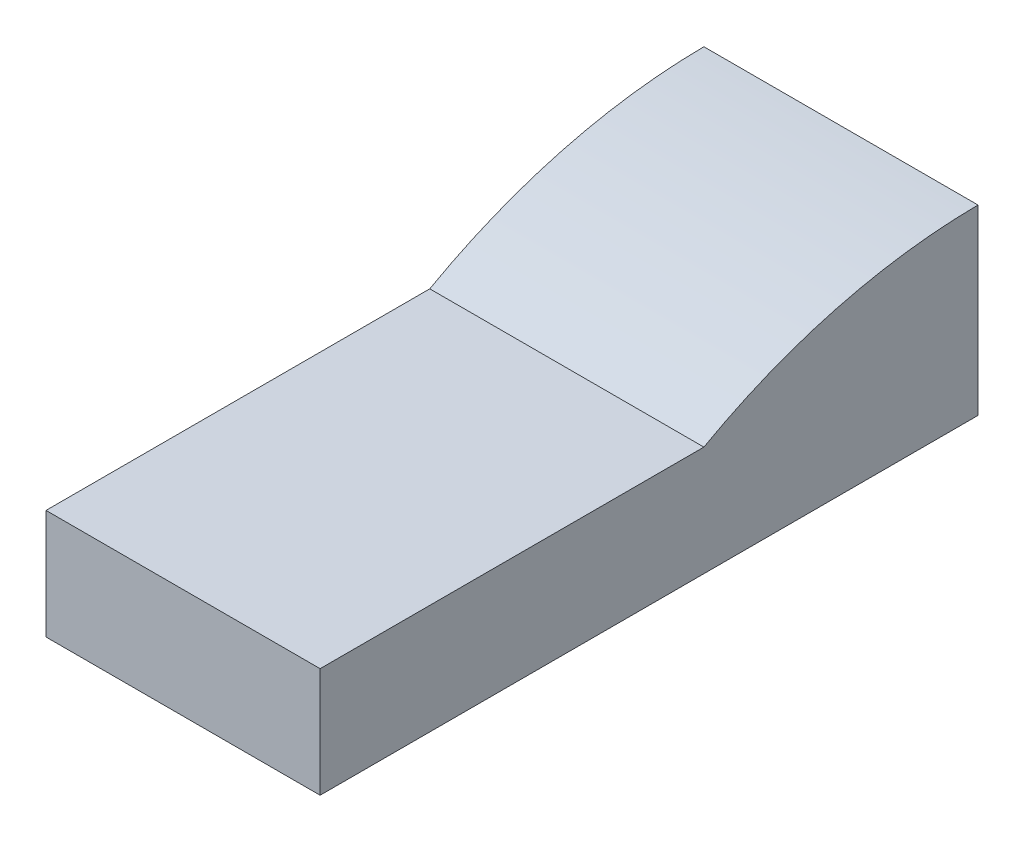
ISO-10303-21;
HEADER;
FILE_DESCRIPTION(('STEP AP214'),'2;1');
FILE_NAME('part.step','',(''),(''),'','','');
FILE_SCHEMA(('AUTOMOTIVE_DESIGN { 1 0 10303 214 1 1 1 1 }'));
ENDSEC;
DATA;
#1=APPLICATION_CONTEXT('core data for automotive mechanical design processes');
#2=APPLICATION_PROTOCOL_DEFINITION('international standard','automotive_design',2000,#1);
#3=PRODUCT_CONTEXT('',#1,'mechanical');
#4=PRODUCT('Part','Part','',(#3));
#5=PRODUCT_RELATED_PRODUCT_CATEGORY('part','',(#4));
#6=PRODUCT_DEFINITION_FORMATION('','',#4);
#7=PRODUCT_DEFINITION_CONTEXT('part definition',#1,'design');
#8=PRODUCT_DEFINITION('design','',#6,#7);
#9=PRODUCT_DEFINITION_SHAPE('','',#8);
#10=(LENGTH_UNIT() NAMED_UNIT(*) SI_UNIT(.MILLI.,.METRE.));
#11=(NAMED_UNIT(*) PLANE_ANGLE_UNIT() SI_UNIT($,.RADIAN.));
#12=(NAMED_UNIT(*) SI_UNIT($,.STERADIAN.) SOLID_ANGLE_UNIT());
#13=UNCERTAINTY_MEASURE_WITH_UNIT(LENGTH_MEASURE(1.E-05),#10,'distance_accuracy_value','');
#14=(GEOMETRIC_REPRESENTATION_CONTEXT(3) GLOBAL_UNCERTAINTY_ASSIGNED_CONTEXT((#13)) GLOBAL_UNIT_ASSIGNED_CONTEXT((#10,
#11,#12)) REPRESENTATION_CONTEXT('',''));
#15=CARTESIAN_POINT('',(0.,0.,0.));
#16=DIRECTION('',(0.,0.,1.));
#17=DIRECTION('',(1.,0.,0.));
#18=AXIS2_PLACEMENT_3D('',#15,#16,#17);
#19=CARTESIAN_POINT('',(12.7,-21.1300723828174,-12.8969393616138));
#20=DIRECTION('',(-1.,0.,0.));
#21=DIRECTION('',(0.,0.,1.));
#22=AXIS2_PLACEMENT_3D('',#19,#20,#21);
#23=CYLINDRICAL_SURFACE('',#22,26.3997273580388);
#24=CARTESIAN_POINT('',(0.,-21.1300723828174,-12.8969393616138));
#25=DIRECTION('',(1.,0.,0.));
#26=DIRECTION('',(0.,0.,-1.));
#27=AXIS2_PLACEMENT_3D('',#24,#25,#26);
#28=CIRCLE('',#27,26.3997273580388);
#29=CARTESIAN_POINT('',(0.,1.905,0.));
#30=VERTEX_POINT('',#29);
#31=CARTESIAN_POINT('',(0.,5.26892039089705,-12.7));
#32=VERTEX_POINT('',#31);
#33=EDGE_CURVE('E108',#30,#32,#28,.F.);
#34=ORIENTED_EDGE('',*,*,#33,.F.);
#35=DIRECTION('',(-1.,0.,0.));
#36=VECTOR('',#35,1.);
#37=CARTESIAN_POINT('',(12.7,1.905,0.));
#38=LINE('',#37,#36);
#39=CARTESIAN_POINT('',(12.7,1.905,0.));
#40=VERTEX_POINT('',#39);
#41=EDGE_CURVE('E11',#40,#30,#38,.T.);
#42=ORIENTED_EDGE('',*,*,#41,.F.);
#43=CARTESIAN_POINT('',(12.7,-21.1300723828174,-12.8969393616138));
#44=DIRECTION('',(1.,0.,0.));
#45=DIRECTION('',(0.,0.,-1.));
#46=AXIS2_PLACEMENT_3D('',#43,#44,#45);
#47=CIRCLE('',#46,26.3997273580388);
#48=CARTESIAN_POINT('',(12.7,5.26892039089705,-12.7));
#49=VERTEX_POINT('',#48);
#50=EDGE_CURVE('E119',#40,#49,#47,.F.);
#51=ORIENTED_EDGE('',*,*,#50,.T.);
#52=DIRECTION('',(-1.,0.,0.));
#53=VECTOR('',#52,1.);
#54=CARTESIAN_POINT('',(12.7,5.26892039089705,-12.7));
#55=LINE('',#54,#53);
#56=EDGE_CURVE('E76',#49,#32,#55,.T.);
#57=ORIENTED_EDGE('',*,*,#56,.T.);
#58=EDGE_LOOP('',(#34,#42,#51,#57));
#59=FACE_BOUND('',#58,.T.);
#60=ADVANCED_FACE('F35',(#59),#23,.T.);
#61=CARTESIAN_POINT('',(12.7,1.905,0.));
#62=DIRECTION('',(0.,-1.,0.));
#63=DIRECTION('',(0.,0.,-1.));
#64=AXIS2_PLACEMENT_3D('',#61,#62,#63);
#65=PLANE('',#64);
#66=DIRECTION('',(0.,0.,1.));
#67=VECTOR('',#66,1.);
#68=CARTESIAN_POINT('',(0.,1.905,0.));
#69=LINE('',#68,#67);
#70=CARTESIAN_POINT('',(0.,1.905,17.78));
#71=VERTEX_POINT('',#70);
#72=EDGE_CURVE('E111',#30,#71,#69,.T.);
#73=ORIENTED_EDGE('',*,*,#72,.T.);
#74=DIRECTION('',(-1.,0.,0.));
#75=VECTOR('',#74,1.);
#76=CARTESIAN_POINT('',(12.7,1.905,17.78));
#77=LINE('',#76,#75);
#78=CARTESIAN_POINT('',(12.7,1.905,17.78));
#79=VERTEX_POINT('',#78);
#80=EDGE_CURVE('E43',#79,#71,#77,.T.);
#81=ORIENTED_EDGE('',*,*,#80,.F.);
#82=DIRECTION('',(0.,0.,1.));
#83=VECTOR('',#82,1.);
#84=CARTESIAN_POINT('',(12.7,1.905,0.));
#85=LINE('',#84,#83);
#86=EDGE_CURVE('E100',#40,#79,#85,.T.);
#87=ORIENTED_EDGE('',*,*,#86,.F.);
#88=ORIENTED_EDGE('',*,*,#41,.T.);
#89=EDGE_LOOP('',(#73,#81,#87,#88));
#90=FACE_BOUND('',#89,.T.);
#91=ADVANCED_FACE('F123',(#90),#65,.F.);
#92=CARTESIAN_POINT('',(12.7,0.,17.78));
#93=DIRECTION('',(0.,0.,1.));
#94=DIRECTION('',(1.,0.,0.));
#95=AXIS2_PLACEMENT_3D('',#92,#93,#94);
#96=PLANE('',#95);
#97=DIRECTION('',(0.,1.,0.));
#98=VECTOR('',#97,1.);
#99=CARTESIAN_POINT('',(0.,0.,17.78));
#100=LINE('',#99,#98);
#101=CARTESIAN_POINT('',(0.,-3.175,17.78));
#102=VERTEX_POINT('',#101);
#103=EDGE_CURVE('E92',#102,#71,#100,.T.);
#104=ORIENTED_EDGE('',*,*,#103,.F.);
#105=DIRECTION('',(-1.,0.,0.));
#106=VECTOR('',#105,1.);
#107=CARTESIAN_POINT('',(12.7,-3.175,17.78));
#108=LINE('',#107,#106);
#109=CARTESIAN_POINT('',(12.7,-3.175,17.78));
#110=VERTEX_POINT('',#109);
#111=EDGE_CURVE('E87',#110,#102,#108,.T.);
#112=ORIENTED_EDGE('',*,*,#111,.F.);
#113=DIRECTION('',(0.,1.,0.));
#114=VECTOR('',#113,1.);
#115=CARTESIAN_POINT('',(12.7,0.,17.78));
#116=LINE('',#115,#114);
#117=EDGE_CURVE('E90',#110,#79,#116,.T.);
#118=ORIENTED_EDGE('',*,*,#117,.T.);
#119=ORIENTED_EDGE('',*,*,#80,.T.);
#120=EDGE_LOOP('',(#104,#112,#118,#119));
#121=FACE_BOUND('',#120,.T.);
#122=ADVANCED_FACE('F89',(#121),#96,.T.);
#123=CARTESIAN_POINT('',(12.7,-3.175,0.));
#124=DIRECTION('',(0.,-1.,0.));
#125=DIRECTION('',(0.,0.,-1.));
#126=AXIS2_PLACEMENT_3D('',#123,#124,#125);
#127=PLANE('',#126);
#128=DIRECTION('',(0.,0.,1.));
#129=VECTOR('',#128,1.);
#130=CARTESIAN_POINT('',(0.,-3.175,0.));
#131=LINE('',#130,#129);
#132=CARTESIAN_POINT('',(0.,-3.175,-12.7));
#133=VERTEX_POINT('',#132);
#134=EDGE_CURVE('E115',#133,#102,#131,.T.);
#135=ORIENTED_EDGE('',*,*,#134,.F.);
#136=DIRECTION('',(-1.,0.,0.));
#137=VECTOR('',#136,1.);
#138=CARTESIAN_POINT('',(12.7,-3.175,-12.7));
#139=LINE('',#138,#137);
#140=CARTESIAN_POINT('',(12.7,-3.175,-12.7));
#141=VERTEX_POINT('',#140);
#142=EDGE_CURVE('E69',#141,#133,#139,.T.);
#143=ORIENTED_EDGE('',*,*,#142,.F.);
#144=DIRECTION('',(0.,0.,1.));
#145=VECTOR('',#144,1.);
#146=CARTESIAN_POINT('',(12.7,-3.175,0.));
#147=LINE('',#146,#145);
#148=EDGE_CURVE('E99',#141,#110,#147,.T.);
#149=ORIENTED_EDGE('',*,*,#148,.T.);
#150=ORIENTED_EDGE('',*,*,#111,.T.);
#151=EDGE_LOOP('',(#135,#143,#149,#150));
#152=FACE_BOUND('',#151,.T.);
#153=ADVANCED_FACE('F103',(#152),#127,.T.);
#154=CARTESIAN_POINT('',(12.7,0.,-12.7));
#155=DIRECTION('',(0.,0.,1.));
#156=DIRECTION('',(0.,-1.,0.));
#157=AXIS2_PLACEMENT_3D('',#154,#155,#156);
#158=PLANE('',#157);
#159=DIRECTION('',(0.,1.,0.));
#160=VECTOR('',#159,1.);
#161=CARTESIAN_POINT('',(0.,0.,-12.7));
#162=LINE('',#161,#160);
#163=EDGE_CURVE('E117',#133,#32,#162,.T.);
#164=ORIENTED_EDGE('',*,*,#163,.T.);
#165=ORIENTED_EDGE('',*,*,#56,.F.);
#166=DIRECTION('',(0.,1.,0.));
#167=VECTOR('',#166,1.);
#168=CARTESIAN_POINT('',(12.7,0.,-12.7));
#169=LINE('',#168,#167);
#170=EDGE_CURVE('E51',#141,#49,#169,.T.);
#171=ORIENTED_EDGE('',*,*,#170,.F.);
#172=ORIENTED_EDGE('',*,*,#142,.T.);
#173=EDGE_LOOP('',(#164,#165,#171,#172));
#174=FACE_BOUND('',#173,.T.);
#175=ADVANCED_FACE('F126',(#174),#158,.F.);
#176=CARTESIAN_POINT('',(12.7,0.,0.));
#177=DIRECTION('',(1.,0.,0.));
#178=DIRECTION('',(0.,0.,-1.));
#179=AXIS2_PLACEMENT_3D('',#176,#177,#178);
#180=PLANE('',#179);
#181=ORIENTED_EDGE('',*,*,#50,.F.);
#182=ORIENTED_EDGE('',*,*,#86,.T.);
#183=ORIENTED_EDGE('',*,*,#117,.F.);
#184=ORIENTED_EDGE('',*,*,#148,.F.);
#185=ORIENTED_EDGE('',*,*,#170,.T.);
#186=EDGE_LOOP('',(#181,#182,#183,#184,#185));
#187=FACE_BOUND('',#186,.T.);
#188=ADVANCED_FACE('F98',(#187),#180,.T.);
#189=CARTESIAN_POINT('',(0.,0.,0.));
#190=DIRECTION('',(1.,0.,0.));
#191=DIRECTION('',(0.,0.,-1.));
#192=AXIS2_PLACEMENT_3D('',#189,#190,#191);
#193=PLANE('',#192);
#194=ORIENTED_EDGE('',*,*,#33,.T.);
#195=ORIENTED_EDGE('',*,*,#163,.F.);
#196=ORIENTED_EDGE('',*,*,#134,.T.);
#197=ORIENTED_EDGE('',*,*,#103,.T.);
#198=ORIENTED_EDGE('',*,*,#72,.F.);
#199=EDGE_LOOP('',(#194,#195,#196,#197,#198));
#200=FACE_BOUND('',#199,.T.);
#201=ADVANCED_FACE('F125',(#200),#193,.F.);
#202=CLOSED_SHELL('',(#60,#91,#122,#153,#175,#188,#201));
#203=MANIFOLD_SOLID_BREP('B2',#202);
#204=ADVANCED_BREP_SHAPE_REPRESENTATION('',(#18,#203),#14);
#205=SHAPE_DEFINITION_REPRESENTATION(#9,#204);
ENDSEC;
END-ISO-10303-21;
